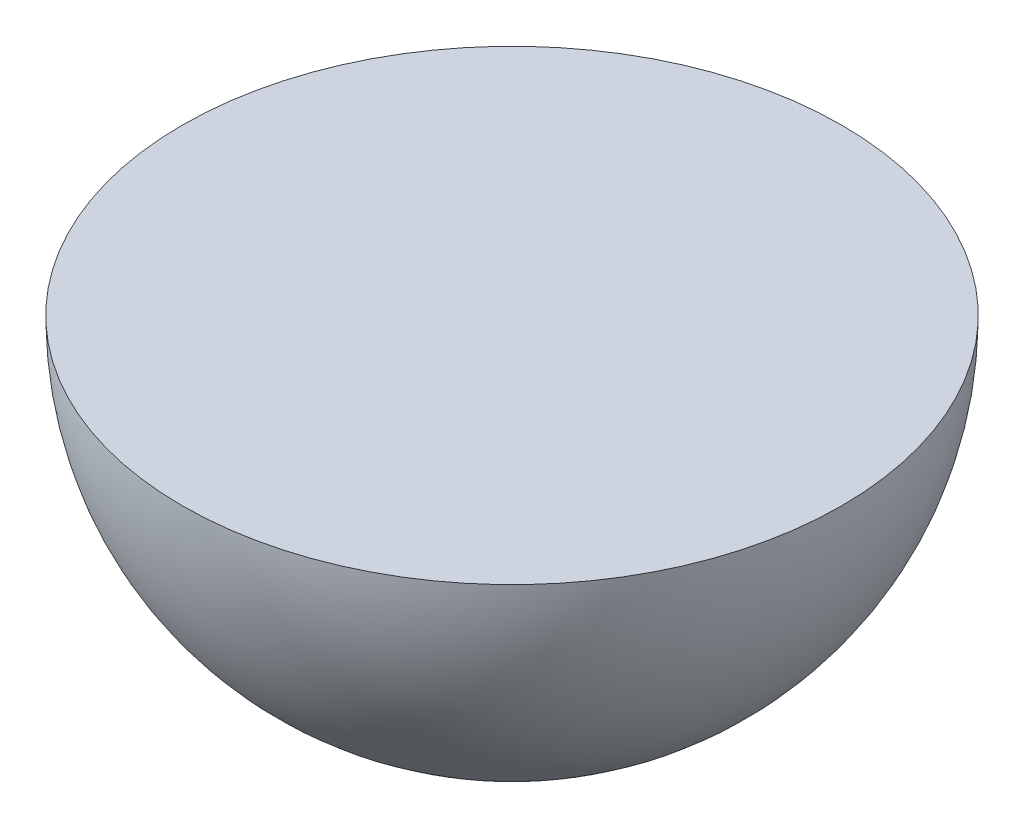
ISO-10303-21;
HEADER;
FILE_DESCRIPTION(('STEP AP214'),'2;1');
FILE_NAME('part.step','',(''),(''),'','','');
FILE_SCHEMA(('AUTOMOTIVE_DESIGN { 1 0 10303 214 1 1 1 1 }'));
ENDSEC;
DATA;
#1=APPLICATION_CONTEXT('core data for automotive mechanical design processes');
#2=APPLICATION_PROTOCOL_DEFINITION('international standard','automotive_design',2000,#1);
#3=PRODUCT_CONTEXT('',#1,'mechanical');
#4=PRODUCT('Part','Part','',(#3));
#5=PRODUCT_RELATED_PRODUCT_CATEGORY('part','',(#4));
#6=PRODUCT_DEFINITION_FORMATION('','',#4);
#7=PRODUCT_DEFINITION_CONTEXT('part definition',#1,'design');
#8=PRODUCT_DEFINITION('design','',#6,#7);
#9=PRODUCT_DEFINITION_SHAPE('','',#8);
#10=(LENGTH_UNIT() NAMED_UNIT(*) SI_UNIT(.MILLI.,.METRE.));
#11=(NAMED_UNIT(*) PLANE_ANGLE_UNIT() SI_UNIT($,.RADIAN.));
#12=(NAMED_UNIT(*) SI_UNIT($,.STERADIAN.) SOLID_ANGLE_UNIT());
#13=UNCERTAINTY_MEASURE_WITH_UNIT(LENGTH_MEASURE(1.E-05),#10,'distance_accuracy_value','');
#14=(GEOMETRIC_REPRESENTATION_CONTEXT(3) GLOBAL_UNCERTAINTY_ASSIGNED_CONTEXT((#13)) GLOBAL_UNIT_ASSIGNED_CONTEXT((#10,
#11,#12)) REPRESENTATION_CONTEXT('',''));
#15=CARTESIAN_POINT('',(0.,0.,0.));
#16=DIRECTION('',(0.,0.,1.));
#17=DIRECTION('',(1.,0.,0.));
#18=AXIS2_PLACEMENT_3D('',#15,#16,#17);
#19=CARTESIAN_POINT('',(0.,55.2269016811668,0.));
#20=DIRECTION('',(0.,-1.,0.));
#21=DIRECTION('',(-1.,0.,0.));
#22=AXIS2_PLACEMENT_3D('',#19,#20,#21);
#23=SPHERICAL_SURFACE('',#22,54.2269016811668);
#24=CARTESIAN_POINT('',(0.,55.222222,0.));
#25=DIRECTION('',(0.,1.,0.));
#26=DIRECTION('',(0.,0.,1.));
#27=AXIS2_PLACEMENT_3D('',#24,#25,#26);
#28=CIRCLE('',#27,54.2269014792429);
#29=CARTESIAN_POINT('',(0.,55.222222,54.2269014792429));
#30=VERTEX_POINT('',#29);
#31=EDGE_CURVE('E11',#30,#30,#28,.F.);
#32=ORIENTED_EDGE('',*,*,#31,.T.);
#33=EDGE_LOOP('',(#32));
#34=FACE_BOUND('',#33,.T.);
#35=ADVANCED_FACE('F42',(#34),#23,.T.);
#36=CARTESIAN_POINT('',(0.,55.222222,0.));
#37=DIRECTION('',(0.,1.,0.));
#38=DIRECTION('',(0.,0.,1.));
#39=AXIS2_PLACEMENT_3D('',#36,#37,#38);
#40=PLANE('',#39);
#41=ORIENTED_EDGE('',*,*,#31,.F.);
#42=EDGE_LOOP('',(#41));
#43=FACE_BOUND('',#42,.T.);
#44=ADVANCED_FACE('F44',(#43),#40,.T.);
#45=CLOSED_SHELL('',(#35,#44));
#46=MANIFOLD_SOLID_BREP('B2',#45);
#47=ADVANCED_BREP_SHAPE_REPRESENTATION('',(#18,#46),#14);
#48=SHAPE_DEFINITION_REPRESENTATION(#9,#47);
ENDSEC;
END-ISO-10303-21;
